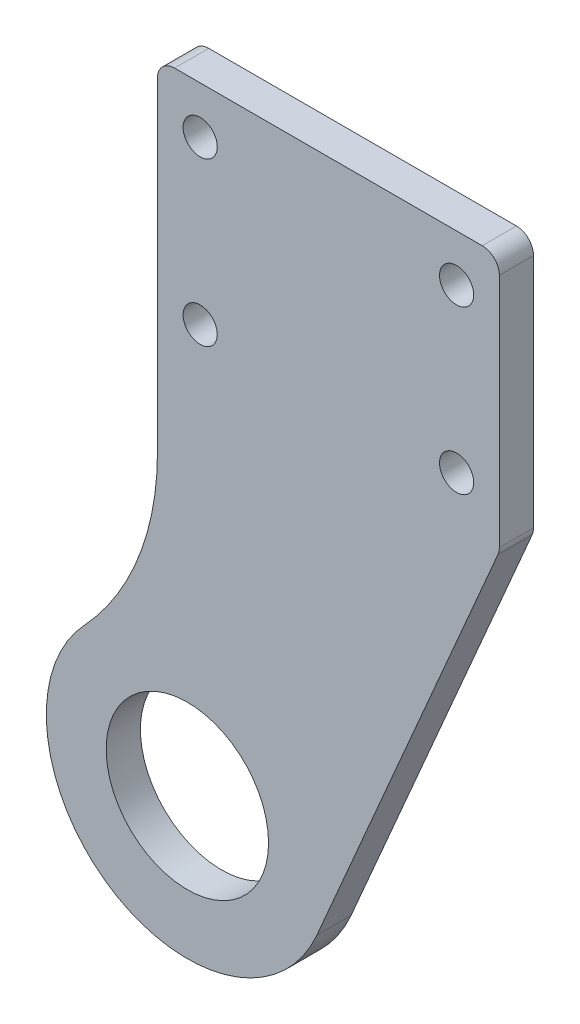
ISO-10303-21;
HEADER;
FILE_DESCRIPTION(('STEP AP214'),'2;1');
FILE_NAME('part.step','',(''),(''),'','','');
FILE_SCHEMA(('AUTOMOTIVE_DESIGN { 1 0 10303 214 1 1 1 1 }'));
ENDSEC;
DATA;
#1=APPLICATION_CONTEXT('core data for automotive mechanical design processes');
#2=APPLICATION_PROTOCOL_DEFINITION('international standard','automotive_design',2000,#1);
#3=PRODUCT_CONTEXT('',#1,'mechanical');
#4=PRODUCT('Part','Part','',(#3));
#5=PRODUCT_RELATED_PRODUCT_CATEGORY('part','',(#4));
#6=PRODUCT_DEFINITION_FORMATION('','',#4);
#7=PRODUCT_DEFINITION_CONTEXT('part definition',#1,'design');
#8=PRODUCT_DEFINITION('design','',#6,#7);
#9=PRODUCT_DEFINITION_SHAPE('','',#8);
#10=(LENGTH_UNIT() NAMED_UNIT(*) SI_UNIT(.MILLI.,.METRE.));
#11=(NAMED_UNIT(*) PLANE_ANGLE_UNIT() SI_UNIT($,.RADIAN.));
#12=(NAMED_UNIT(*) SI_UNIT($,.STERADIAN.) SOLID_ANGLE_UNIT());
#13=UNCERTAINTY_MEASURE_WITH_UNIT(LENGTH_MEASURE(1.E-05),#10,'distance_accuracy_value','');
#14=(GEOMETRIC_REPRESENTATION_CONTEXT(3) GLOBAL_UNCERTAINTY_ASSIGNED_CONTEXT((#13)) GLOBAL_UNIT_ASSIGNED_CONTEXT((#10,
#11,#12)) REPRESENTATION_CONTEXT('',''));
#15=CARTESIAN_POINT('',(0.,0.,0.));
#16=DIRECTION('',(0.,0.,1.));
#17=DIRECTION('',(1.,0.,0.));
#18=AXIS2_PLACEMENT_3D('',#15,#16,#17);
#19=CARTESIAN_POINT('',(0.,0.,4.));
#20=DIRECTION('',(0.,0.,1.));
#21=DIRECTION('',(1.,0.,0.));
#22=AXIS2_PLACEMENT_3D('',#19,#20,#21);
#23=PLANE('',#22);
#24=CARTESIAN_POINT('',(1.50000000000002,67.5,4.));
#25=DIRECTION('',(0.,0.,1.));
#26=DIRECTION('',(1.,0.,0.));
#27=AXIS2_PLACEMENT_3D('',#24,#25,#26);
#28=CIRCLE('',#27,2.);
#29=CARTESIAN_POINT('',(3.50000000000002,67.5,4.));
#30=VERTEX_POINT('',#29);
#31=EDGE_CURVE('E377',#30,#30,#28,.F.);
#32=ORIENTED_EDGE('',*,*,#31,.T.);
#33=EDGE_LOOP('',(#32));
#34=FACE_BOUND('',#33,.T.);
#35=CARTESIAN_POINT('',(31.5,48.5,4.));
#36=DIRECTION('',(0.,0.,1.));
#37=DIRECTION('',(1.,0.,0.));
#38=AXIS2_PLACEMENT_3D('',#35,#36,#37);
#39=CIRCLE('',#38,2.);
#40=CARTESIAN_POINT('',(33.5,48.5,4.));
#41=VERTEX_POINT('',#40);
#42=EDGE_CURVE('E382',#41,#41,#39,.F.);
#43=ORIENTED_EDGE('',*,*,#42,.T.);
#44=EDGE_LOOP('',(#43));
#45=FACE_BOUND('',#44,.T.);
#46=CARTESIAN_POINT('',(1.50000000000002,48.5,4.));
#47=DIRECTION('',(0.,0.,1.));
#48=DIRECTION('',(1.,0.,0.));
#49=AXIS2_PLACEMENT_3D('',#46,#47,#48);
#50=CIRCLE('',#49,2.);
#51=CARTESIAN_POINT('',(3.50000000000002,48.5,4.));
#52=VERTEX_POINT('',#51);
#53=EDGE_CURVE('E387',#52,#52,#50,.F.);
#54=ORIENTED_EDGE('',*,*,#53,.T.);
#55=EDGE_LOOP('',(#54));
#56=FACE_BOUND('',#55,.T.);
#57=CARTESIAN_POINT('',(31.5,67.5,4.));
#58=DIRECTION('',(0.,0.,1.));
#59=DIRECTION('',(1.,0.,0.));
#60=AXIS2_PLACEMENT_3D('',#57,#58,#59);
#61=CIRCLE('',#60,2.);
#62=CARTESIAN_POINT('',(33.5,67.5,4.));
#63=VERTEX_POINT('',#62);
#64=EDGE_CURVE('E133',#63,#63,#61,.F.);
#65=ORIENTED_EDGE('',*,*,#64,.T.);
#66=EDGE_LOOP('',(#65));
#67=FACE_BOUND('',#66,.T.);
#68=CARTESIAN_POINT('',(0.,0.,4.));
#69=DIRECTION('',(0.,0.,1.));
#70=DIRECTION('',(1.,0.,0.));
#71=AXIS2_PLACEMENT_3D('',#68,#69,#70);
#72=CIRCLE('',#71,9.5);
#73=CARTESIAN_POINT('',(9.5,0.,4.));
#74=VERTEX_POINT('',#73);
#75=EDGE_CURVE('E156',#74,#74,#72,.T.);
#76=ORIENTED_EDGE('',*,*,#75,.F.);
#77=EDGE_LOOP('',(#76));
#78=FACE_BOUND('',#77,.T.);
#79=DIRECTION('',(-0.395798141542986,-0.918337536612284,0.));
#80=VECTOR('',#79,1.);
#81=CARTESIAN_POINT('',(36.5,43.,4.));
#82=LINE('',#81,#80);
#83=CARTESIAN_POINT('',(36.3366750732246,42.621050744863,4.));
#84=VERTEX_POINT('',#83);
#85=CARTESIAN_POINT('',(15.1525693541027,-6.53066933545926,4.));
#86=VERTEX_POINT('',#85);
#87=EDGE_CURVE('E143',#84,#86,#82,.T.);
#88=ORIENTED_EDGE('',*,*,#87,.F.);
#89=CARTESIAN_POINT('',(34.5,43.4126470279489,4.));
#90=DIRECTION('',(0.,0.,1.));
#91=DIRECTION('',(1.,0.,0.));
#92=AXIS2_PLACEMENT_3D('',#89,#90,#91);
#93=CIRCLE('',#92,2.);
#94=CARTESIAN_POINT('',(36.5,43.4126470279489,4.));
#95=VERTEX_POINT('',#94);
#96=EDGE_CURVE('E173',#84,#95,#93,.T.);
#97=ORIENTED_EDGE('',*,*,#96,.T.);
#98=DIRECTION('',(0.,1.,0.));
#99=VECTOR('',#98,1.);
#100=CARTESIAN_POINT('',(36.5,73.,4.));
#101=LINE('',#100,#99);
#102=CARTESIAN_POINT('',(36.5,71.,4.));
#103=VERTEX_POINT('',#102);
#104=EDGE_CURVE('E148',#95,#103,#101,.T.);
#105=ORIENTED_EDGE('',*,*,#104,.T.);
#106=CARTESIAN_POINT('',(34.5,71.,4.));
#107=DIRECTION('',(0.,0.,1.));
#108=DIRECTION('',(1.,0.,0.));
#109=AXIS2_PLACEMENT_3D('',#106,#107,#108);
#110=CIRCLE('',#109,2.);
#111=CARTESIAN_POINT('',(34.5,73.,4.));
#112=VERTEX_POINT('',#111);
#113=EDGE_CURVE('E171',#103,#112,#110,.T.);
#114=ORIENTED_EDGE('',*,*,#113,.T.);
#115=DIRECTION('',(-1.,0.,0.));
#116=VECTOR('',#115,1.);
#117=CARTESIAN_POINT('',(-16.5,73.,4.));
#118=LINE('',#117,#116);
#119=CARTESIAN_POINT('',(-1.49999999999998,73.,4.));
#120=VERTEX_POINT('',#119);
#121=EDGE_CURVE('E117',#112,#120,#118,.T.);
#122=ORIENTED_EDGE('',*,*,#121,.T.);
#123=CARTESIAN_POINT('',(-1.49999999999998,71.,4.));
#124=DIRECTION('',(0.,0.,1.));
#125=DIRECTION('',(1.,0.,0.));
#126=AXIS2_PLACEMENT_3D('',#123,#124,#125);
#127=CIRCLE('',#126,2.);
#128=CARTESIAN_POINT('',(-3.49999999999998,71.,4.));
#129=VERTEX_POINT('',#128);
#130=EDGE_CURVE('E169',#120,#129,#127,.T.);
#131=ORIENTED_EDGE('',*,*,#130,.T.);
#132=DIRECTION('',(0.,1.,0.));
#133=VECTOR('',#132,1.);
#134=CARTESIAN_POINT('',(-3.49999999999998,43.,4.));
#135=LINE('',#134,#133);
#136=CARTESIAN_POINT('',(-3.49999999999998,33.,4.));
#137=VERTEX_POINT('',#136);
#138=EDGE_CURVE('E131',#137,#129,#135,.T.);
#139=ORIENTED_EDGE('',*,*,#138,.F.);
#140=CARTESIAN_POINT('',(-35.3846153846153,33.,4.));
#141=DIRECTION('',(0.,0.,1.));
#142=DIRECTION('',(1.,0.,0.));
#143=AXIS2_PLACEMENT_3D('',#140,#141,#142);
#144=CIRCLE('',#143,31.8846153846153);
#145=CARTESIAN_POINT('',(-12.0667726550079,11.2535771065183,4.));
#146=VERTEX_POINT('',#145);
#147=EDGE_CURVE('E125',#146,#137,#144,.T.);
#148=ORIENTED_EDGE('',*,*,#147,.F.);
#149=CARTESIAN_POINT('',(0.,0.,4.));
#150=DIRECTION('',(0.,0.,1.));
#151=DIRECTION('',(1.,0.,0.));
#152=AXIS2_PLACEMENT_3D('',#149,#150,#151);
#153=CIRCLE('',#152,16.5);
#154=EDGE_CURVE('E107',#146,#86,#153,.T.);
#155=ORIENTED_EDGE('',*,*,#154,.T.);
#156=EDGE_LOOP('',(#88,#97,#105,#114,#122,#131,#139,#148,#155));
#157=FACE_BOUND('',#156,.T.);
#158=ADVANCED_FACE('F35',(#34,#45,#56,#67,#78,#157),#23,.T.);
#159=CARTESIAN_POINT('',(0.,0.,0.));
#160=DIRECTION('',(0.,0.,1.));
#161=DIRECTION('',(1.,0.,0.));
#162=AXIS2_PLACEMENT_3D('',#159,#160,#161);
#163=PLANE('',#162);
#164=CARTESIAN_POINT('',(1.50000000000002,67.5,0.));
#165=DIRECTION('',(0.,0.,-1.));
#166=DIRECTION('',(-1.,0.,0.));
#167=AXIS2_PLACEMENT_3D('',#164,#165,#166);
#168=CIRCLE('',#167,2.);
#169=CARTESIAN_POINT('',(-0.499999999999983,67.5,0.));
#170=VERTEX_POINT('',#169);
#171=EDGE_CURVE('E379',#170,#170,#168,.T.);
#172=ORIENTED_EDGE('',*,*,#171,.F.);
#173=EDGE_LOOP('',(#172));
#174=FACE_BOUND('',#173,.T.);
#175=CARTESIAN_POINT('',(31.5,48.5,0.));
#176=DIRECTION('',(0.,0.,-1.));
#177=DIRECTION('',(-1.,0.,0.));
#178=AXIS2_PLACEMENT_3D('',#175,#176,#177);
#179=CIRCLE('',#178,2.);
#180=CARTESIAN_POINT('',(29.5,48.5,0.));
#181=VERTEX_POINT('',#180);
#182=EDGE_CURVE('E385',#181,#181,#179,.T.);
#183=ORIENTED_EDGE('',*,*,#182,.F.);
#184=EDGE_LOOP('',(#183));
#185=FACE_BOUND('',#184,.T.);
#186=CARTESIAN_POINT('',(1.50000000000002,48.5,0.));
#187=DIRECTION('',(0.,0.,-1.));
#188=DIRECTION('',(-1.,0.,0.));
#189=AXIS2_PLACEMENT_3D('',#186,#187,#188);
#190=CIRCLE('',#189,2.);
#191=CARTESIAN_POINT('',(-0.499999999999982,48.5,0.));
#192=VERTEX_POINT('',#191);
#193=EDGE_CURVE('E393',#192,#192,#190,.T.);
#194=ORIENTED_EDGE('',*,*,#193,.F.);
#195=EDGE_LOOP('',(#194));
#196=FACE_BOUND('',#195,.T.);
#197=CARTESIAN_POINT('',(31.5,67.5,0.));
#198=DIRECTION('',(0.,0.,-1.));
#199=DIRECTION('',(-1.,0.,0.));
#200=AXIS2_PLACEMENT_3D('',#197,#198,#199);
#201=CIRCLE('',#200,2.);
#202=CARTESIAN_POINT('',(29.5,67.5,0.));
#203=VERTEX_POINT('',#202);
#204=EDGE_CURVE('E136',#203,#203,#201,.T.);
#205=ORIENTED_EDGE('',*,*,#204,.F.);
#206=EDGE_LOOP('',(#205));
#207=FACE_BOUND('',#206,.T.);
#208=CARTESIAN_POINT('',(0.,0.,0.));
#209=DIRECTION('',(0.,0.,1.));
#210=DIRECTION('',(1.,0.,0.));
#211=AXIS2_PLACEMENT_3D('',#208,#209,#210);
#212=CIRCLE('',#211,9.5);
#213=CARTESIAN_POINT('',(9.5,0.,0.));
#214=VERTEX_POINT('',#213);
#215=EDGE_CURVE('E153',#214,#214,#212,.T.);
#216=ORIENTED_EDGE('',*,*,#215,.T.);
#217=EDGE_LOOP('',(#216));
#218=FACE_BOUND('',#217,.T.);
#219=DIRECTION('',(0.,-1.,0.));
#220=VECTOR('',#219,1.);
#221=CARTESIAN_POINT('',(36.5,73.,0.));
#222=LINE('',#221,#220);
#223=CARTESIAN_POINT('',(36.5,71.,0.));
#224=VERTEX_POINT('',#223);
#225=CARTESIAN_POINT('',(36.5,43.4126470279489,0.));
#226=VERTEX_POINT('',#225);
#227=EDGE_CURVE('E150',#224,#226,#222,.T.);
#228=ORIENTED_EDGE('',*,*,#227,.T.);
#229=CARTESIAN_POINT('',(34.5,43.4126470279489,0.));
#230=DIRECTION('',(0.,0.,1.));
#231=DIRECTION('',(1.,0.,0.));
#232=AXIS2_PLACEMENT_3D('',#229,#230,#231);
#233=CIRCLE('',#232,2.);
#234=CARTESIAN_POINT('',(36.3366750732246,42.621050744863,0.));
#235=VERTEX_POINT('',#234);
#236=EDGE_CURVE('E183',#226,#235,#233,.F.);
#237=ORIENTED_EDGE('',*,*,#236,.T.);
#238=DIRECTION('',(-0.395798141542986,-0.918337536612284,0.));
#239=VECTOR('',#238,1.);
#240=CARTESIAN_POINT('',(36.5,43.,0.));
#241=LINE('',#240,#239);
#242=CARTESIAN_POINT('',(15.1525693541027,-6.53066933545926,0.));
#243=VERTEX_POINT('',#242);
#244=EDGE_CURVE('E141',#235,#243,#241,.T.);
#245=ORIENTED_EDGE('',*,*,#244,.T.);
#246=CARTESIAN_POINT('',(0.,0.,0.));
#247=DIRECTION('',(0.,0.,1.));
#248=DIRECTION('',(1.,0.,0.));
#249=AXIS2_PLACEMENT_3D('',#246,#247,#248);
#250=CIRCLE('',#249,16.5);
#251=CARTESIAN_POINT('',(-12.0667726550079,11.2535771065183,0.));
#252=VERTEX_POINT('',#251);
#253=EDGE_CURVE('E159',#252,#243,#250,.T.);
#254=ORIENTED_EDGE('',*,*,#253,.F.);
#255=CARTESIAN_POINT('',(-35.3846153846153,33.,0.));
#256=DIRECTION('',(0.,0.,1.));
#257=DIRECTION('',(1.,0.,0.));
#258=AXIS2_PLACEMENT_3D('',#255,#256,#257);
#259=CIRCLE('',#258,31.8846153846153);
#260=CARTESIAN_POINT('',(-3.49999999999998,33.,0.));
#261=VERTEX_POINT('',#260);
#262=EDGE_CURVE('E127',#261,#252,#259,.F.);
#263=ORIENTED_EDGE('',*,*,#262,.F.);
#264=DIRECTION('',(0.,-1.,0.));
#265=VECTOR('',#264,1.);
#266=CARTESIAN_POINT('',(-3.49999999999998,43.,0.));
#267=LINE('',#266,#265);
#268=CARTESIAN_POINT('',(-3.49999999999998,71.,0.));
#269=VERTEX_POINT('',#268);
#270=EDGE_CURVE('E146',#269,#261,#267,.T.);
#271=ORIENTED_EDGE('',*,*,#270,.F.);
#272=CARTESIAN_POINT('',(-1.49999999999998,71.,0.));
#273=DIRECTION('',(0.,0.,1.));
#274=DIRECTION('',(1.,0.,0.));
#275=AXIS2_PLACEMENT_3D('',#272,#273,#274);
#276=CIRCLE('',#275,2.);
#277=CARTESIAN_POINT('',(-1.49999999999998,73.,0.));
#278=VERTEX_POINT('',#277);
#279=EDGE_CURVE('E50',#269,#278,#276,.F.);
#280=ORIENTED_EDGE('',*,*,#279,.T.);
#281=DIRECTION('',(-1.,0.,0.));
#282=VECTOR('',#281,1.);
#283=CARTESIAN_POINT('',(-16.5,73.,0.));
#284=LINE('',#283,#282);
#285=CARTESIAN_POINT('',(34.5,73.,0.));
#286=VERTEX_POINT('',#285);
#287=EDGE_CURVE('E118',#286,#278,#284,.T.);
#288=ORIENTED_EDGE('',*,*,#287,.F.);
#289=CARTESIAN_POINT('',(34.5,71.,0.));
#290=DIRECTION('',(0.,0.,1.));
#291=DIRECTION('',(1.,0.,0.));
#292=AXIS2_PLACEMENT_3D('',#289,#290,#291);
#293=CIRCLE('',#292,2.);
#294=EDGE_CURVE('E181',#286,#224,#293,.F.);
#295=ORIENTED_EDGE('',*,*,#294,.T.);
#296=EDGE_LOOP('',(#228,#237,#245,#254,#263,#271,#280,#288,#295));
#297=FACE_BOUND('',#296,.T.);
#298=ADVANCED_FACE('F200',(#174,#185,#196,#207,#218,#297),#163,.F.);
#299=CARTESIAN_POINT('',(0.,0.,4.));
#300=DIRECTION('',(0.,0.,-1.));
#301=DIRECTION('',(-1.,0.,0.));
#302=AXIS2_PLACEMENT_3D('',#299,#300,#301);
#303=CYLINDRICAL_SURFACE('',#302,16.5);
#304=ORIENTED_EDGE('',*,*,#253,.T.);
#305=DIRECTION('',(0.,0.,-1.));
#306=VECTOR('',#305,1.);
#307=CARTESIAN_POINT('',(15.1525693541027,-6.53066933545927,60.4117647731269));
#308=LINE('',#307,#306);
#309=EDGE_CURVE('E113',#86,#243,#308,.T.);
#310=ORIENTED_EDGE('',*,*,#309,.F.);
#311=ORIENTED_EDGE('',*,*,#154,.F.);
#312=DIRECTION('',(0.,0.,1.));
#313=VECTOR('',#312,1.);
#314=CARTESIAN_POINT('',(-12.0667726550079,11.2535771065183,-39.8622628559895));
#315=LINE('',#314,#313);
#316=EDGE_CURVE('E111',#252,#146,#315,.T.);
#317=ORIENTED_EDGE('',*,*,#316,.F.);
#318=EDGE_LOOP('',(#304,#310,#311,#317));
#319=FACE_BOUND('',#318,.T.);
#320=ADVANCED_FACE('F110',(#319),#303,.T.);
#321=CARTESIAN_POINT('',(-16.5,73.,4.));
#322=DIRECTION('',(0.,-1.,0.));
#323=DIRECTION('',(0.,0.,-1.));
#324=AXIS2_PLACEMENT_3D('',#321,#322,#323);
#325=PLANE('',#324);
#326=ORIENTED_EDGE('',*,*,#121,.F.);
#327=DIRECTION('',(0.,0.,1.));
#328=VECTOR('',#327,1.);
#329=CARTESIAN_POINT('',(34.5,73.,0.));
#330=LINE('',#329,#328);
#331=EDGE_CURVE('E43',#112,#286,#330,.F.);
#332=ORIENTED_EDGE('',*,*,#331,.T.);
#333=ORIENTED_EDGE('',*,*,#287,.T.);
#334=DIRECTION('',(0.,0.,1.));
#335=VECTOR('',#334,1.);
#336=CARTESIAN_POINT('',(-1.49999999999998,73.,4.));
#337=LINE('',#336,#335);
#338=EDGE_CURVE('E185',#278,#120,#337,.T.);
#339=ORIENTED_EDGE('',*,*,#338,.T.);
#340=EDGE_LOOP('',(#326,#332,#333,#339));
#341=FACE_BOUND('',#340,.T.);
#342=ADVANCED_FACE('F188',(#341),#325,.F.);
#343=CARTESIAN_POINT('',(0.,0.,4.));
#344=DIRECTION('',(0.,0.,-1.));
#345=DIRECTION('',(-1.,0.,0.));
#346=AXIS2_PLACEMENT_3D('',#343,#344,#345);
#347=CYLINDRICAL_SURFACE('',#346,9.5);
#348=ORIENTED_EDGE('',*,*,#215,.F.);
#349=EDGE_LOOP('',(#348));
#350=FACE_BOUND('',#349,.T.);
#351=ORIENTED_EDGE('',*,*,#75,.T.);
#352=EDGE_LOOP('',(#351));
#353=FACE_BOUND('',#352,.T.);
#354=ADVANCED_FACE('F217',(#350,#353),#347,.F.);
#355=CARTESIAN_POINT('',(36.5,73.,-36.0555127546399));
#356=DIRECTION('',(1.,0.,0.));
#357=DIRECTION('',(0.,1.,0.));
#358=AXIS2_PLACEMENT_3D('',#355,#356,#357);
#359=PLANE('',#358);
#360=ORIENTED_EDGE('',*,*,#104,.F.);
#361=DIRECTION('',(0.,0.,1.));
#362=VECTOR('',#361,1.);
#363=CARTESIAN_POINT('',(36.5,43.4126470279489,-36.0555127546399));
#364=LINE('',#363,#362);
#365=EDGE_CURVE('E178',#95,#226,#364,.F.);
#366=ORIENTED_EDGE('',*,*,#365,.T.);
#367=ORIENTED_EDGE('',*,*,#227,.F.);
#368=DIRECTION('',(0.,0.,1.));
#369=VECTOR('',#368,1.);
#370=CARTESIAN_POINT('',(36.5,71.,4.));
#371=LINE('',#370,#369);
#372=EDGE_CURVE('E175',#224,#103,#371,.T.);
#373=ORIENTED_EDGE('',*,*,#372,.T.);
#374=EDGE_LOOP('',(#360,#366,#367,#373));
#375=FACE_BOUND('',#374,.T.);
#376=ADVANCED_FACE('F197',(#375),#359,.T.);
#377=CARTESIAN_POINT('',(-3.49999999999998,43.,-74.1484996476665));
#378=DIRECTION('',(1.,0.,0.));
#379=DIRECTION('',(0.,0.,-1.));
#380=AXIS2_PLACEMENT_3D('',#377,#378,#379);
#381=PLANE('',#380);
#382=ORIENTED_EDGE('',*,*,#138,.T.);
#383=DIRECTION('',(0.,0.,1.));
#384=VECTOR('',#383,1.);
#385=CARTESIAN_POINT('',(-3.49999999999998,71.,-74.1484996476665));
#386=LINE('',#385,#384);
#387=EDGE_CURVE('E11',#129,#269,#386,.F.);
#388=ORIENTED_EDGE('',*,*,#387,.T.);
#389=ORIENTED_EDGE('',*,*,#270,.T.);
#390=DIRECTION('',(0.,0.,1.));
#391=VECTOR('',#390,1.);
#392=CARTESIAN_POINT('',(-3.49999999999998,33.,-39.8622628559895));
#393=LINE('',#392,#391);
#394=EDGE_CURVE('E128',#261,#137,#393,.T.);
#395=ORIENTED_EDGE('',*,*,#394,.T.);
#396=EDGE_LOOP('',(#382,#388,#389,#395));
#397=FACE_BOUND('',#396,.T.);
#398=ADVANCED_FACE('F209',(#397),#381,.F.);
#399=CARTESIAN_POINT('',(36.5,43.,60.4117647731269));
#400=DIRECTION('',(0.918337536612284,-0.395798141542986,0.));
#401=DIRECTION('',(0.395798141542986,0.918337536612284,0.));
#402=AXIS2_PLACEMENT_3D('',#399,#400,#401);
#403=PLANE('',#402);
#404=ORIENTED_EDGE('',*,*,#244,.F.);
#405=DIRECTION('',(0.,0.,1.));
#406=VECTOR('',#405,1.);
#407=CARTESIAN_POINT('',(36.3366750732246,42.621050744863,60.4117647731269));
#408=LINE('',#407,#406);
#409=EDGE_CURVE('E164',#235,#84,#408,.T.);
#410=ORIENTED_EDGE('',*,*,#409,.T.);
#411=ORIENTED_EDGE('',*,*,#87,.T.);
#412=ORIENTED_EDGE('',*,*,#309,.T.);
#413=EDGE_LOOP('',(#404,#410,#411,#412));
#414=FACE_BOUND('',#413,.T.);
#415=ADVANCED_FACE('F206',(#414),#403,.T.);
#416=CARTESIAN_POINT('',(-35.3846153846153,33.,-39.8622628559895));
#417=DIRECTION('',(0.,0.,1.));
#418=DIRECTION('',(1.,0.,0.));
#419=AXIS2_PLACEMENT_3D('',#416,#417,#418);
#420=CYLINDRICAL_SURFACE('',#419,31.8846153846153);
#421=ORIENTED_EDGE('',*,*,#262,.T.);
#422=ORIENTED_EDGE('',*,*,#316,.T.);
#423=ORIENTED_EDGE('',*,*,#147,.T.);
#424=ORIENTED_EDGE('',*,*,#394,.F.);
#425=EDGE_LOOP('',(#421,#422,#423,#424));
#426=FACE_BOUND('',#425,.T.);
#427=ADVANCED_FACE('F123',(#426),#420,.F.);
#428=CARTESIAN_POINT('',(31.5,67.5,9.65685424949239));
#429=DIRECTION('',(0.,0.,-1.));
#430=DIRECTION('',(-1.,0.,0.));
#431=AXIS2_PLACEMENT_3D('',#428,#429,#430);
#432=CYLINDRICAL_SURFACE('',#431,2.);
#433=ORIENTED_EDGE('',*,*,#204,.T.);
#434=EDGE_LOOP('',(#433));
#435=FACE_BOUND('',#434,.T.);
#436=ORIENTED_EDGE('',*,*,#64,.F.);
#437=EDGE_LOOP('',(#436));
#438=FACE_BOUND('',#437,.T.);
#439=ADVANCED_FACE('F326',(#435,#438),#432,.F.);
#440=CARTESIAN_POINT('',(1.50000000000002,48.5,9.65685424949239));
#441=DIRECTION('',(0.,0.,-1.));
#442=DIRECTION('',(-1.,0.,0.));
#443=AXIS2_PLACEMENT_3D('',#440,#441,#442);
#444=CYLINDRICAL_SURFACE('',#443,2.);
#445=ORIENTED_EDGE('',*,*,#193,.T.);
#446=EDGE_LOOP('',(#445));
#447=FACE_BOUND('',#446,.T.);
#448=ORIENTED_EDGE('',*,*,#53,.F.);
#449=EDGE_LOOP('',(#448));
#450=FACE_BOUND('',#449,.T.);
#451=ADVANCED_FACE('F316',(#447,#450),#444,.F.);
#452=CARTESIAN_POINT('',(31.5,48.5,9.65685424949239));
#453=DIRECTION('',(0.,0.,-1.));
#454=DIRECTION('',(-1.,0.,0.));
#455=AXIS2_PLACEMENT_3D('',#452,#453,#454);
#456=CYLINDRICAL_SURFACE('',#455,2.);
#457=ORIENTED_EDGE('',*,*,#182,.T.);
#458=EDGE_LOOP('',(#457));
#459=FACE_BOUND('',#458,.T.);
#460=ORIENTED_EDGE('',*,*,#42,.F.);
#461=EDGE_LOOP('',(#460));
#462=FACE_BOUND('',#461,.T.);
#463=ADVANCED_FACE('F306',(#459,#462),#456,.F.);
#464=CARTESIAN_POINT('',(1.50000000000002,67.5,9.65685424949239));
#465=DIRECTION('',(0.,0.,-1.));
#466=DIRECTION('',(-1.,0.,0.));
#467=AXIS2_PLACEMENT_3D('',#464,#465,#466);
#468=CYLINDRICAL_SURFACE('',#467,2.);
#469=ORIENTED_EDGE('',*,*,#171,.T.);
#470=EDGE_LOOP('',(#469));
#471=FACE_BOUND('',#470,.T.);
#472=ORIENTED_EDGE('',*,*,#31,.F.);
#473=EDGE_LOOP('',(#472));
#474=FACE_BOUND('',#473,.T.);
#475=ADVANCED_FACE('F237',(#471,#474),#468,.F.);
#476=CARTESIAN_POINT('',(34.5,43.4126470279489,60.4117647731269));
#477=DIRECTION('',(0.,0.,1.));
#478=DIRECTION('',(1.,0.,0.));
#479=AXIS2_PLACEMENT_3D('',#476,#477,#478);
#480=CYLINDRICAL_SURFACE('',#479,2.);
#481=ORIENTED_EDGE('',*,*,#236,.F.);
#482=ORIENTED_EDGE('',*,*,#365,.F.);
#483=ORIENTED_EDGE('',*,*,#96,.F.);
#484=ORIENTED_EDGE('',*,*,#409,.F.);
#485=EDGE_LOOP('',(#481,#482,#483,#484));
#486=FACE_BOUND('',#485,.T.);
#487=ADVANCED_FACE('F204',(#486),#480,.T.);
#488=CARTESIAN_POINT('',(34.5,71.,-36.0555127546399));
#489=DIRECTION('',(0.,0.,-1.));
#490=DIRECTION('',(-1.,0.,0.));
#491=AXIS2_PLACEMENT_3D('',#488,#489,#490);
#492=CYLINDRICAL_SURFACE('',#491,2.);
#493=ORIENTED_EDGE('',*,*,#294,.F.);
#494=ORIENTED_EDGE('',*,*,#331,.F.);
#495=ORIENTED_EDGE('',*,*,#113,.F.);
#496=ORIENTED_EDGE('',*,*,#372,.F.);
#497=EDGE_LOOP('',(#493,#494,#495,#496));
#498=FACE_BOUND('',#497,.T.);
#499=ADVANCED_FACE('F194',(#498),#492,.T.);
#500=CARTESIAN_POINT('',(-1.49999999999998,71.,4.));
#501=DIRECTION('',(0.,0.,1.));
#502=DIRECTION('',(1.,0.,0.));
#503=AXIS2_PLACEMENT_3D('',#500,#501,#502);
#504=CYLINDRICAL_SURFACE('',#503,2.);
#505=ORIENTED_EDGE('',*,*,#279,.F.);
#506=ORIENTED_EDGE('',*,*,#387,.F.);
#507=ORIENTED_EDGE('',*,*,#130,.F.);
#508=ORIENTED_EDGE('',*,*,#338,.F.);
#509=EDGE_LOOP('',(#505,#506,#507,#508));
#510=FACE_BOUND('',#509,.T.);
#511=ADVANCED_FACE('F37',(#510),#504,.T.);
#512=CLOSED_SHELL('',(#158,#298,#320,#342,#354,#376,#398,#415,#427,#439,#451,#463,#475,#487,
#499,#511));
#513=MANIFOLD_SOLID_BREP('B2',#512);
#514=ADVANCED_BREP_SHAPE_REPRESENTATION('',(#18,#513),#14);
#515=SHAPE_DEFINITION_REPRESENTATION(#9,#514);
ENDSEC;
END-ISO-10303-21;
